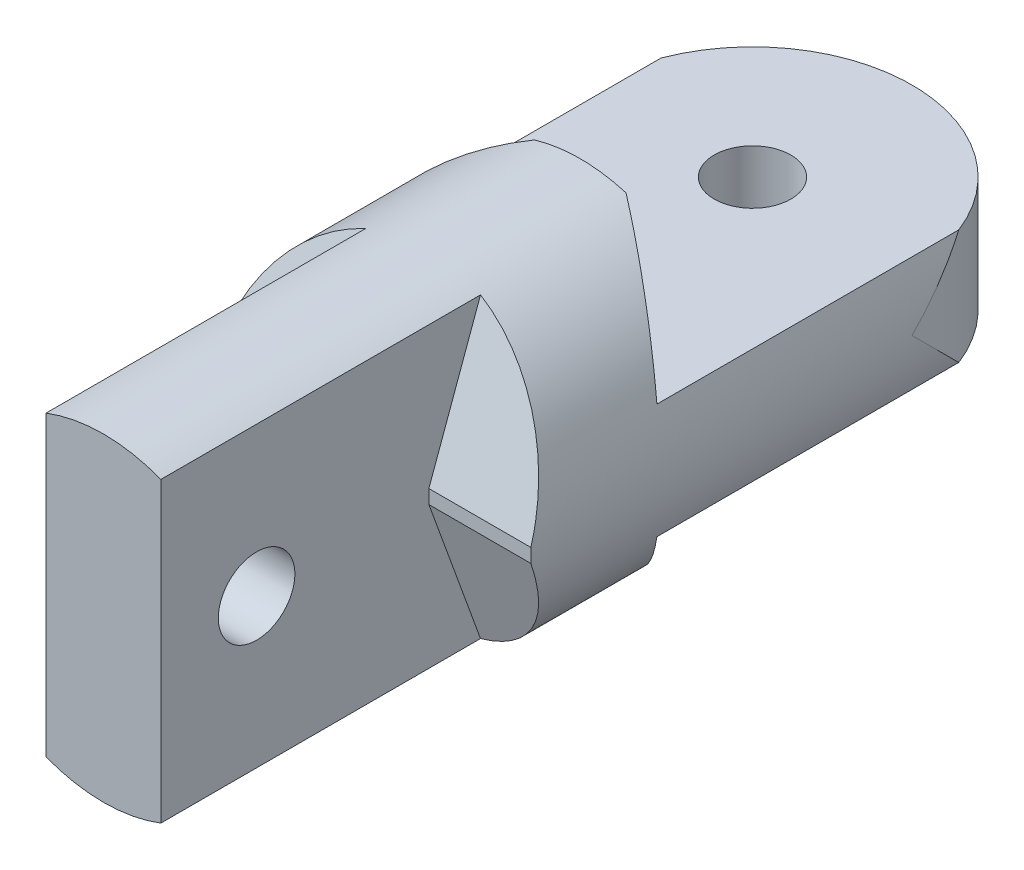
ISO-10303-21;
HEADER;
FILE_DESCRIPTION(('STEP AP214'),'2;1');
FILE_NAME('part.step','',(''),(''),'','','');
FILE_SCHEMA(('AUTOMOTIVE_DESIGN { 1 0 10303 214 1 1 1 1 }'));
ENDSEC;
DATA;
#1=APPLICATION_CONTEXT('core data for automotive mechanical design processes');
#2=APPLICATION_PROTOCOL_DEFINITION('international standard','automotive_design',2000,#1);
#3=PRODUCT_CONTEXT('',#1,'mechanical');
#4=PRODUCT('Part','Part','',(#3));
#5=PRODUCT_RELATED_PRODUCT_CATEGORY('part','',(#4));
#6=PRODUCT_DEFINITION_FORMATION('','',#4);
#7=PRODUCT_DEFINITION_CONTEXT('part definition',#1,'design');
#8=PRODUCT_DEFINITION('design','',#6,#7);
#9=PRODUCT_DEFINITION_SHAPE('','',#8);
#10=(LENGTH_UNIT() NAMED_UNIT(*) SI_UNIT(.MILLI.,.METRE.));
#11=(NAMED_UNIT(*) PLANE_ANGLE_UNIT() SI_UNIT($,.RADIAN.));
#12=(NAMED_UNIT(*) SI_UNIT($,.STERADIAN.) SOLID_ANGLE_UNIT());
#13=UNCERTAINTY_MEASURE_WITH_UNIT(LENGTH_MEASURE(1.E-05),#10,'distance_accuracy_value','');
#14=(GEOMETRIC_REPRESENTATION_CONTEXT(3) GLOBAL_UNCERTAINTY_ASSIGNED_CONTEXT((#13)) GLOBAL_UNIT_ASSIGNED_CONTEXT((#10,
#11,#12)) REPRESENTATION_CONTEXT('',''));
#15=CARTESIAN_POINT('',(0.,0.,0.));
#16=DIRECTION('',(0.,0.,1.));
#17=DIRECTION('',(1.,0.,0.));
#18=AXIS2_PLACEMENT_3D('',#15,#16,#17);
#19=CARTESIAN_POINT('',(0.,0.,-68.3590613364812));
#20=DIRECTION('',(0.,0.,1.));
#21=DIRECTION('',(1.,0.,0.));
#22=AXIS2_PLACEMENT_3D('',#19,#20,#21);
#23=CYLINDRICAL_SURFACE('',#22,12.5);
#24=CARTESIAN_POINT('',(0.,0.,-26.));
#25=DIRECTION('',(0.,0.,-1.));
#26=DIRECTION('',(0.,-1.,0.));
#27=AXIS2_PLACEMENT_3D('',#24,#25,#26);
#28=CIRCLE('',#27,12.5);
#29=CARTESIAN_POINT('',(12.4881835001478,0.543390160598795,-26.));
#30=VERTEX_POINT('',#29);
#31=CARTESIAN_POINT('',(12.4881835001478,-0.543390160598794,-26.));
#32=VERTEX_POINT('',#31);
#33=EDGE_CURVE('E366',#30,#32,#28,.T.);
#34=ORIENTED_EDGE('',*,*,#33,.T.);
#35=CARTESIAN_POINT('',(0.,0.,-25.8022221559489));
#36=DIRECTION('',(0.,-0.342020143325666,0.939692620785909));
#37=DIRECTION('',(0.,0.939692620785909,0.342020143325666));
#38=AXIS2_PLACEMENT_3D('',#35,#36,#37);
#39=ELLIPSE('',#38,13.3022221559489,12.5);
#40=CARTESIAN_POINT('',(4.5,-11.6619037896906,-30.0468080102725));
#41=VERTEX_POINT('',#40);
#42=EDGE_CURVE('E316',#32,#41,#39,.F.);
#43=ORIENTED_EDGE('',*,*,#42,.T.);
#44=DIRECTION('',(0.,0.,1.));
#45=VECTOR('',#44,1.);
#46=CARTESIAN_POINT('',(4.50000000000004,-11.6619037896906,-26.));
#47=LINE('',#46,#45);
#48=CARTESIAN_POINT('',(4.50000000000004,-11.6619037896906,-5.00000000000001));
#49=VERTEX_POINT('',#48);
#50=EDGE_CURVE('E352',#41,#49,#47,.T.);
#51=ORIENTED_EDGE('',*,*,#50,.T.);
#52=CARTESIAN_POINT('',(0.,0.,-5.));
#53=DIRECTION('',(0.,0.,1.));
#54=DIRECTION('',(1.,0.,0.));
#55=AXIS2_PLACEMENT_3D('',#52,#53,#54);
#56=CIRCLE('',#55,12.5);
#57=CARTESIAN_POINT('',(-4.49999999999996,-11.6619037896906,-5.));
#58=VERTEX_POINT('',#57);
#59=EDGE_CURVE('E336',#58,#49,#56,.T.);
#60=ORIENTED_EDGE('',*,*,#59,.F.);
#61=DIRECTION('',(0.,0.,1.));
#62=VECTOR('',#61,1.);
#63=CARTESIAN_POINT('',(-4.49999999999996,-11.6619037896906,-26.));
#64=LINE('',#63,#62);
#65=CARTESIAN_POINT('',(-4.5,-11.6619037896906,-30.0468080102725));
#66=VERTEX_POINT('',#65);
#67=EDGE_CURVE('E363',#66,#58,#64,.T.);
#68=ORIENTED_EDGE('',*,*,#67,.F.);
#69=CARTESIAN_POINT('',(0.,0.,-25.8022221559489));
#70=DIRECTION('',(0.,0.342020143325666,-0.939692620785909));
#71=DIRECTION('',(0.,0.939692620785909,0.342020143325666));
#72=AXIS2_PLACEMENT_3D('',#69,#70,#71);
#73=ELLIPSE('',#72,13.3022221559489,12.5);
#74=CARTESIAN_POINT('',(-12.4881835001478,-0.543390160598794,-26.));
#75=VERTEX_POINT('',#74);
#76=EDGE_CURVE('E332',#75,#66,#73,.F.);
#77=ORIENTED_EDGE('',*,*,#76,.F.);
#78=CARTESIAN_POINT('',(0.,0.,-26.));
#79=DIRECTION('',(0.,0.,-1.));
#80=DIRECTION('',(0.,-1.,0.));
#81=AXIS2_PLACEMENT_3D('',#78,#79,#80);
#82=CIRCLE('',#81,12.5);
#83=CARTESIAN_POINT('',(-12.4881835001478,0.543390160598795,-26.));
#84=VERTEX_POINT('',#83);
#85=EDGE_CURVE('E362',#75,#84,#82,.T.);
#86=ORIENTED_EDGE('',*,*,#85,.T.);
#87=CARTESIAN_POINT('',(0.,0.,-25.8022221559489));
#88=DIRECTION('',(0.,0.342020143325666,0.939692620785909));
#89=DIRECTION('',(0.,-0.939692620785909,0.342020143325666));
#90=AXIS2_PLACEMENT_3D('',#87,#88,#89);
#91=ELLIPSE('',#90,13.3022221559489,12.5);
#92=CARTESIAN_POINT('',(-4.5,11.6619037896906,-30.0468080102725));
#93=VERTEX_POINT('',#92);
#94=EDGE_CURVE('E325',#84,#93,#91,.F.);
#95=ORIENTED_EDGE('',*,*,#94,.T.);
#96=DIRECTION('',(0.,0.,1.));
#97=VECTOR('',#96,1.);
#98=CARTESIAN_POINT('',(-4.50000000000004,11.6619037896906,-26.));
#99=LINE('',#98,#97);
#100=CARTESIAN_POINT('',(-4.50000000000004,11.6619037896906,-5.));
#101=VERTEX_POINT('',#100);
#102=EDGE_CURVE('E359',#93,#101,#99,.T.);
#103=ORIENTED_EDGE('',*,*,#102,.T.);
#104=CARTESIAN_POINT('',(0.,0.,-5.));
#105=DIRECTION('',(0.,0.,1.));
#106=DIRECTION('',(1.,0.,0.));
#107=AXIS2_PLACEMENT_3D('',#104,#105,#106);
#108=CIRCLE('',#107,12.5);
#109=CARTESIAN_POINT('',(4.49999999999996,11.6619037896906,-5.));
#110=VERTEX_POINT('',#109);
#111=EDGE_CURVE('E344',#110,#101,#108,.T.);
#112=ORIENTED_EDGE('',*,*,#111,.F.);
#113=DIRECTION('',(0.,0.,1.));
#114=VECTOR('',#113,1.);
#115=CARTESIAN_POINT('',(4.49999999999996,11.6619037896906,-26.));
#116=LINE('',#115,#114);
#117=CARTESIAN_POINT('',(4.5,11.6619037896906,-30.0468080102725));
#118=VERTEX_POINT('',#117);
#119=EDGE_CURVE('E374',#118,#110,#116,.T.);
#120=ORIENTED_EDGE('',*,*,#119,.F.);
#121=CARTESIAN_POINT('',(0.,0.,-25.8022221559489));
#122=DIRECTION('',(0.,-0.342020143325666,-0.939692620785909));
#123=DIRECTION('',(0.,-0.939692620785909,0.342020143325666));
#124=AXIS2_PLACEMENT_3D('',#121,#122,#123);
#125=ELLIPSE('',#124,13.3022221559489,12.5);
#126=EDGE_CURVE('E312',#30,#118,#125,.F.);
#127=ORIENTED_EDGE('',*,*,#126,.F.);
#128=EDGE_LOOP('',(#34,#43,#51,#60,#68,#77,#86,#95,#103,#112,#120,#127));
#129=FACE_BOUND('',#128,.T.);
#130=CARTESIAN_POINT('',(0.,0.,-44.8720900376281));
#131=DIRECTION('',(0.573576436351042,0.,-0.819152044288995));
#132=DIRECTION('',(0.819152044288995,0.,0.573576436351042));
#133=AXIS2_PLACEMENT_3D('',#130,#131,#132);
#134=ELLIPSE('',#133,15.2596823595181,12.5);
#135=CARTESIAN_POINT('',(3.58897693042875,-11.9736896816666,-42.3590613364812));
#136=VERTEX_POINT('',#135);
#137=CARTESIAN_POINT('',(11.6619037896906,-4.5,-36.7063370942105));
#138=VERTEX_POINT('',#137);
#139=EDGE_CURVE('E153',#136,#138,#134,.F.);
#140=ORIENTED_EDGE('',*,*,#139,.T.);
#141=DIRECTION('',(0.,0.,-1.));
#142=VECTOR('',#141,1.);
#143=CARTESIAN_POINT('',(11.6619037896906,-4.5,-42.3590613364812));
#144=LINE('',#143,#142);
#145=CARTESIAN_POINT('',(11.6619037896906,-4.5,-60.3590613364812));
#146=VERTEX_POINT('',#145);
#147=EDGE_CURVE('E258',#138,#146,#144,.T.);
#148=ORIENTED_EDGE('',*,*,#147,.T.);
#149=CARTESIAN_POINT('',(0.,0.,-55.8590613364812));
#150=DIRECTION('',(0.,-0.707106781186548,0.707106781186547));
#151=DIRECTION('',(0.,0.707106781186548,0.707106781186547));
#152=AXIS2_PLACEMENT_3D('',#149,#150,#151);
#153=ELLIPSE('',#152,17.6776695296637,12.5);
#154=CARTESIAN_POINT('',(12.5,0.,-55.8590613364812));
#155=VERTEX_POINT('',#154);
#156=EDGE_CURVE('E395',#155,#146,#153,.F.);
#157=ORIENTED_EDGE('',*,*,#156,.F.);
#158=CARTESIAN_POINT('',(0.,0.,-55.8590613364812));
#159=DIRECTION('',(0.,0.707106781186548,0.707106781186547));
#160=DIRECTION('',(0.,-0.707106781186548,0.707106781186547));
#161=AXIS2_PLACEMENT_3D('',#158,#159,#160);
#162=ELLIPSE('',#161,17.6776695296637,12.5);
#163=CARTESIAN_POINT('',(11.6619037896906,4.5,-60.3590613364812));
#164=VERTEX_POINT('',#163);
#165=EDGE_CURVE('E396',#164,#155,#162,.F.);
#166=ORIENTED_EDGE('',*,*,#165,.F.);
#167=DIRECTION('',(0.,0.,-1.));
#168=VECTOR('',#167,1.);
#169=CARTESIAN_POINT('',(11.6619037896906,4.5,-42.3590613364812));
#170=LINE('',#169,#168);
#171=CARTESIAN_POINT('',(11.6619037896906,4.5,-36.7063370942105));
#172=VERTEX_POINT('',#171);
#173=EDGE_CURVE('E409',#172,#164,#170,.T.);
#174=ORIENTED_EDGE('',*,*,#173,.F.);
#175=CARTESIAN_POINT('',(0.,0.,-44.8720900376281));
#176=DIRECTION('',(-0.573576436351042,0.,0.819152044288995));
#177=DIRECTION('',(0.819152044288995,0.,0.573576436351042));
#178=AXIS2_PLACEMENT_3D('',#175,#176,#177);
#179=ELLIPSE('',#178,15.2596823595181,12.5);
#180=CARTESIAN_POINT('',(3.58897693042875,11.9736896816666,-42.3590613364812));
#181=VERTEX_POINT('',#180);
#182=EDGE_CURVE('E294',#181,#172,#179,.F.);
#183=ORIENTED_EDGE('',*,*,#182,.F.);
#184=CARTESIAN_POINT('',(0.,0.,-42.3590613364812));
#185=DIRECTION('',(0.,0.,-1.));
#186=DIRECTION('',(-1.,0.,0.));
#187=AXIS2_PLACEMENT_3D('',#184,#185,#186);
#188=CIRCLE('',#187,12.5);
#189=CARTESIAN_POINT('',(-3.58897693042875,11.9736896816666,-42.3590613364812));
#190=VERTEX_POINT('',#189);
#191=EDGE_CURVE('E417',#190,#181,#188,.T.);
#192=ORIENTED_EDGE('',*,*,#191,.F.);
#193=CARTESIAN_POINT('',(0.,0.,-44.8720900376281));
#194=DIRECTION('',(-0.573576436351042,0.,-0.819152044288995));
#195=DIRECTION('',(-0.819152044288995,0.,0.573576436351042));
#196=AXIS2_PLACEMENT_3D('',#193,#194,#195);
#197=ELLIPSE('',#196,15.2596823595181,12.5);
#198=CARTESIAN_POINT('',(-11.6619037896906,4.5,-36.7063370942105));
#199=VERTEX_POINT('',#198);
#200=EDGE_CURVE('E160',#190,#199,#197,.F.);
#201=ORIENTED_EDGE('',*,*,#200,.T.);
#202=DIRECTION('',(0.,0.,-1.));
#203=VECTOR('',#202,1.);
#204=CARTESIAN_POINT('',(-11.6619037896906,4.5,-42.3590613364812));
#205=LINE('',#204,#203);
#206=CARTESIAN_POINT('',(-11.6619037896906,4.5,-60.3590613364812));
#207=VERTEX_POINT('',#206);
#208=EDGE_CURVE('E421',#199,#207,#205,.T.);
#209=ORIENTED_EDGE('',*,*,#208,.T.);
#210=CARTESIAN_POINT('',(-12.5,0.,-55.8590613364812));
#211=VERTEX_POINT('',#210);
#212=EDGE_CURVE('E399',#211,#207,#162,.F.);
#213=ORIENTED_EDGE('',*,*,#212,.F.);
#214=CARTESIAN_POINT('',(-11.6619037896906,-4.5,-60.3590613364812));
#215=VERTEX_POINT('',#214);
#216=EDGE_CURVE('E392',#215,#211,#153,.F.);
#217=ORIENTED_EDGE('',*,*,#216,.F.);
#218=DIRECTION('',(0.,0.,-1.));
#219=VECTOR('',#218,1.);
#220=CARTESIAN_POINT('',(-11.6619037896906,-4.5,-42.3590613364812));
#221=LINE('',#220,#219);
#222=CARTESIAN_POINT('',(-11.6619037896906,-4.5,-36.7063370942105));
#223=VERTEX_POINT('',#222);
#224=EDGE_CURVE('E270',#223,#215,#221,.T.);
#225=ORIENTED_EDGE('',*,*,#224,.F.);
#226=CARTESIAN_POINT('',(0.,0.,-44.8720900376281));
#227=DIRECTION('',(0.573576436351042,0.,0.819152044288995));
#228=DIRECTION('',(-0.819152044288995,0.,0.573576436351042));
#229=AXIS2_PLACEMENT_3D('',#226,#227,#228);
#230=ELLIPSE('',#229,15.2596823595181,12.5);
#231=CARTESIAN_POINT('',(-3.58897693042875,-11.9736896816666,-42.3590613364812));
#232=VERTEX_POINT('',#231);
#233=EDGE_CURVE('E282',#232,#223,#230,.F.);
#234=ORIENTED_EDGE('',*,*,#233,.F.);
#235=CARTESIAN_POINT('',(0.,0.,-42.3590613364812));
#236=DIRECTION('',(0.,0.,-1.));
#237=DIRECTION('',(-1.,0.,0.));
#238=AXIS2_PLACEMENT_3D('',#235,#236,#237);
#239=CIRCLE('',#238,12.5);
#240=EDGE_CURVE('E277',#136,#232,#239,.T.);
#241=ORIENTED_EDGE('',*,*,#240,.F.);
#242=EDGE_LOOP('',(#140,#148,#157,#166,#174,#183,#192,#201,#209,#213,#217,#225,#234,#241));
#243=FACE_BOUND('',#242,.T.);
#244=ADVANCED_FACE('F138',(#129,#243),#23,.T.);
#245=CARTESIAN_POINT('',(0.,0.,-42.3590613364812));
#246=DIRECTION('',(0.,0.,-1.));
#247=DIRECTION('',(-1.,0.,0.));
#248=AXIS2_PLACEMENT_3D('',#245,#246,#247);
#249=PLANE('',#248);
#250=DIRECTION('',(1.,0.,0.));
#251=VECTOR('',#250,1.);
#252=CARTESIAN_POINT('',(0.,-4.5,-42.3590613364812));
#253=LINE('',#252,#251);
#254=CARTESIAN_POINT('',(-3.58897693042875,-4.5,-42.3590613364812));
#255=VERTEX_POINT('',#254);
#256=CARTESIAN_POINT('',(3.58897693042875,-4.5,-42.3590613364812));
#257=VERTEX_POINT('',#256);
#258=EDGE_CURVE('E408',#255,#257,#253,.T.);
#259=ORIENTED_EDGE('',*,*,#258,.T.);
#260=DIRECTION('',(0.,-1.,0.));
#261=VECTOR('',#260,1.);
#262=CARTESIAN_POINT('',(3.58897693042875,0.,-42.3590613364812));
#263=LINE('',#262,#261);
#264=EDGE_CURVE('E13',#257,#136,#263,.T.);
#265=ORIENTED_EDGE('',*,*,#264,.T.);
#266=ORIENTED_EDGE('',*,*,#240,.T.);
#267=DIRECTION('',(0.,-1.,0.));
#268=VECTOR('',#267,1.);
#269=CARTESIAN_POINT('',(-3.58897693042875,0.,-42.3590613364812));
#270=LINE('',#269,#268);
#271=EDGE_CURVE('E146',#255,#232,#270,.T.);
#272=ORIENTED_EDGE('',*,*,#271,.F.);
#273=EDGE_LOOP('',(#259,#265,#266,#272));
#274=FACE_BOUND('',#273,.T.);
#275=ADVANCED_FACE('F489',(#274),#249,.T.);
#276=CARTESIAN_POINT('',(0.,0.,-42.3590613364812));
#277=DIRECTION('',(0.,0.,-1.));
#278=DIRECTION('',(-1.,0.,0.));
#279=AXIS2_PLACEMENT_3D('',#276,#277,#278);
#280=PLANE('',#279);
#281=DIRECTION('',(0.,1.,0.));
#282=VECTOR('',#281,1.);
#283=CARTESIAN_POINT('',(3.58897693042875,0.,-42.3590613364812));
#284=LINE('',#283,#282);
#285=CARTESIAN_POINT('',(3.58897693042875,4.5,-42.3590613364812));
#286=VERTEX_POINT('',#285);
#287=EDGE_CURVE('E291',#286,#181,#284,.T.);
#288=ORIENTED_EDGE('',*,*,#287,.F.);
#289=DIRECTION('',(1.,0.,0.));
#290=VECTOR('',#289,1.);
#291=CARTESIAN_POINT('',(0.,4.5,-42.3590613364812));
#292=LINE('',#291,#290);
#293=CARTESIAN_POINT('',(-3.58897693042875,4.5,-42.3590613364812));
#294=VERTEX_POINT('',#293);
#295=EDGE_CURVE('E404',#294,#286,#292,.T.);
#296=ORIENTED_EDGE('',*,*,#295,.F.);
#297=DIRECTION('',(0.,1.,0.));
#298=VECTOR('',#297,1.);
#299=CARTESIAN_POINT('',(-3.58897693042875,0.,-42.3590613364812));
#300=LINE('',#299,#298);
#301=EDGE_CURVE('E445',#294,#190,#300,.T.);
#302=ORIENTED_EDGE('',*,*,#301,.T.);
#303=ORIENTED_EDGE('',*,*,#191,.T.);
#304=EDGE_LOOP('',(#288,#296,#302,#303));
#305=FACE_BOUND('',#304,.T.);
#306=ADVANCED_FACE('F474',(#305),#280,.T.);
#307=CARTESIAN_POINT('',(0.,0.,-26.));
#308=DIRECTION('',(0.,0.,1.));
#309=DIRECTION('',(0.,-1.,0.));
#310=AXIS2_PLACEMENT_3D('',#307,#308,#309);
#311=PLANE('',#310);
#312=DIRECTION('',(0.,1.,0.));
#313=VECTOR('',#312,1.);
#314=CARTESIAN_POINT('',(4.5,0.,-26.));
#315=LINE('',#314,#313);
#316=CARTESIAN_POINT('',(4.5,-0.543390160598794,-26.));
#317=VERTEX_POINT('',#316);
#318=CARTESIAN_POINT('',(4.5,0.543390160598795,-26.));
#319=VERTEX_POINT('',#318);
#320=EDGE_CURVE('E377',#317,#319,#315,.T.);
#321=ORIENTED_EDGE('',*,*,#320,.F.);
#322=DIRECTION('',(1.,0.,0.));
#323=VECTOR('',#322,1.);
#324=CARTESIAN_POINT('',(0.,-0.543390160598794,-26.));
#325=LINE('',#324,#323);
#326=EDGE_CURVE('E441',#317,#32,#325,.T.);
#327=ORIENTED_EDGE('',*,*,#326,.T.);
#328=ORIENTED_EDGE('',*,*,#33,.F.);
#329=DIRECTION('',(1.,0.,0.));
#330=VECTOR('',#329,1.);
#331=CARTESIAN_POINT('',(0.,0.543390160598795,-26.));
#332=LINE('',#331,#330);
#333=EDGE_CURVE('E438',#319,#30,#332,.T.);
#334=ORIENTED_EDGE('',*,*,#333,.F.);
#335=EDGE_LOOP('',(#321,#327,#328,#334));
#336=FACE_BOUND('',#335,.T.);
#337=ADVANCED_FACE('F500',(#336),#311,.T.);
#338=CARTESIAN_POINT('',(0.,0.,-26.));
#339=DIRECTION('',(0.,0.,1.));
#340=DIRECTION('',(0.,-1.,0.));
#341=AXIS2_PLACEMENT_3D('',#338,#339,#340);
#342=PLANE('',#341);
#343=DIRECTION('',(-1.,0.,0.));
#344=VECTOR('',#343,1.);
#345=CARTESIAN_POINT('',(0.,-0.543390160598794,-26.));
#346=LINE('',#345,#344);
#347=CARTESIAN_POINT('',(-4.5,-0.543390160598794,-26.));
#348=VERTEX_POINT('',#347);
#349=EDGE_CURVE('E435',#348,#75,#346,.T.);
#350=ORIENTED_EDGE('',*,*,#349,.F.);
#351=DIRECTION('',(0.,1.,0.));
#352=VECTOR('',#351,1.);
#353=CARTESIAN_POINT('',(-4.5,0.,-26.));
#354=LINE('',#353,#352);
#355=CARTESIAN_POINT('',(-4.5,0.543390160598789,-26.));
#356=VERTEX_POINT('',#355);
#357=EDGE_CURVE('E370',#348,#356,#354,.T.);
#358=ORIENTED_EDGE('',*,*,#357,.T.);
#359=DIRECTION('',(-1.,0.,0.));
#360=VECTOR('',#359,1.);
#361=CARTESIAN_POINT('',(0.,0.543390160598795,-26.));
#362=LINE('',#361,#360);
#363=EDGE_CURVE('E431',#356,#84,#362,.T.);
#364=ORIENTED_EDGE('',*,*,#363,.T.);
#365=ORIENTED_EDGE('',*,*,#85,.F.);
#366=EDGE_LOOP('',(#350,#358,#364,#365));
#367=FACE_BOUND('',#366,.T.);
#368=ADVANCED_FACE('F522',(#367),#342,.T.);
#369=CARTESIAN_POINT('',(-4.5,0.,-26.));
#370=DIRECTION('',(1.,0.,0.));
#371=DIRECTION('',(0.,0.,-1.));
#372=AXIS2_PLACEMENT_3D('',#369,#370,#371);
#373=PLANE('',#372);
#374=DIRECTION('',(0.,-1.,0.));
#375=VECTOR('',#374,1.);
#376=CARTESIAN_POINT('',(-4.50000000000004,11.6619037896906,-5.));
#377=LINE('',#376,#375);
#378=EDGE_CURVE('E348',#101,#58,#377,.T.);
#379=ORIENTED_EDGE('',*,*,#378,.F.);
#380=ORIENTED_EDGE('',*,*,#102,.F.);
#381=DIRECTION('',(0.,0.939692620785909,-0.342020143325666));
#382=VECTOR('',#381,1.);
#383=CARTESIAN_POINT('',(-4.5,-60.3140998160292,-3.84968511635381));
#384=LINE('',#383,#382);
#385=EDGE_CURVE('E320',#356,#93,#384,.T.);
#386=ORIENTED_EDGE('',*,*,#385,.F.);
#387=ORIENTED_EDGE('',*,*,#357,.F.);
#388=DIRECTION('',(0.,-0.939692620785909,-0.342020143325666));
#389=VECTOR('',#388,1.);
#390=CARTESIAN_POINT('',(-4.5,8.29267435211168,-22.7839355293175));
#391=LINE('',#390,#389);
#392=EDGE_CURVE('E321',#348,#66,#391,.T.);
#393=ORIENTED_EDGE('',*,*,#392,.T.);
#394=ORIENTED_EDGE('',*,*,#67,.T.);
#395=EDGE_LOOP('',(#379,#380,#386,#387,#393,#394));
#396=FACE_BOUND('',#395,.T.);
#397=CARTESIAN_POINT('',(-4.5,0.,-12.5));
#398=DIRECTION('',(1.,0.,0.));
#399=DIRECTION('',(0.,0.,-1.));
#400=AXIS2_PLACEMENT_3D('',#397,#398,#399);
#401=CIRCLE('',#400,3.);
#402=CARTESIAN_POINT('',(-4.5,0.,-9.49999999999999));
#403=VERTEX_POINT('',#402);
#404=EDGE_CURVE('E358',#403,#403,#401,.T.);
#405=ORIENTED_EDGE('',*,*,#404,.T.);
#406=EDGE_LOOP('',(#405));
#407=FACE_BOUND('',#406,.T.);
#408=ADVANCED_FACE('F512',(#396,#407),#373,.F.);
#409=CARTESIAN_POINT('',(4.5,0.,-26.));
#410=DIRECTION('',(1.,0.,0.));
#411=DIRECTION('',(0.,0.,-1.));
#412=AXIS2_PLACEMENT_3D('',#409,#410,#411);
#413=PLANE('',#412);
#414=DIRECTION('',(0.,-0.939692620785909,-0.342020143325666));
#415=VECTOR('',#414,1.);
#416=CARTESIAN_POINT('',(4.5,8.29267435211168,-22.7839355293175));
#417=LINE('',#416,#415);
#418=EDGE_CURVE('E308',#317,#41,#417,.T.);
#419=ORIENTED_EDGE('',*,*,#418,.F.);
#420=ORIENTED_EDGE('',*,*,#320,.T.);
#421=DIRECTION('',(0.,0.939692620785909,-0.342020143325666));
#422=VECTOR('',#421,1.);
#423=CARTESIAN_POINT('',(4.5,-60.3140998160292,-3.84968511635381));
#424=LINE('',#423,#422);
#425=EDGE_CURVE('E304',#319,#118,#424,.T.);
#426=ORIENTED_EDGE('',*,*,#425,.T.);
#427=ORIENTED_EDGE('',*,*,#119,.T.);
#428=DIRECTION('',(0.,1.,0.));
#429=VECTOR('',#428,1.);
#430=CARTESIAN_POINT('',(4.50000000000004,-11.6619037896906,-5.));
#431=LINE('',#430,#429);
#432=EDGE_CURVE('E340',#49,#110,#431,.T.);
#433=ORIENTED_EDGE('',*,*,#432,.F.);
#434=ORIENTED_EDGE('',*,*,#50,.F.);
#435=EDGE_LOOP('',(#419,#420,#426,#427,#433,#434));
#436=FACE_BOUND('',#435,.T.);
#437=CARTESIAN_POINT('',(4.5,0.,-12.5));
#438=DIRECTION('',(1.,0.,0.));
#439=DIRECTION('',(0.,0.,-1.));
#440=AXIS2_PLACEMENT_3D('',#437,#438,#439);
#441=CIRCLE('',#440,3.);
#442=CARTESIAN_POINT('',(4.5,0.,-9.49999999999999));
#443=VERTEX_POINT('',#442);
#444=EDGE_CURVE('E353',#443,#443,#441,.T.);
#445=ORIENTED_EDGE('',*,*,#444,.F.);
#446=EDGE_LOOP('',(#445));
#447=FACE_BOUND('',#446,.T.);
#448=ADVANCED_FACE('F503',(#436,#447),#413,.T.);
#449=CARTESIAN_POINT('',(0.,4.5,-42.3590613364812));
#450=DIRECTION('',(0.,1.,0.));
#451=DIRECTION('',(0.,0.,1.));
#452=AXIS2_PLACEMENT_3D('',#449,#450,#451);
#453=PLANE('',#452);
#454=ORIENTED_EDGE('',*,*,#173,.T.);
#455=CARTESIAN_POINT('',(0.,4.5,-55.8590613364812));
#456=DIRECTION('',(0.,1.,0.));
#457=DIRECTION('',(0.,0.,1.));
#458=AXIS2_PLACEMENT_3D('',#455,#456,#457);
#459=CIRCLE('',#458,12.5);
#460=EDGE_CURVE('E357',#207,#164,#459,.F.);
#461=ORIENTED_EDGE('',*,*,#460,.F.);
#462=ORIENTED_EDGE('',*,*,#208,.F.);
#463=DIRECTION('',(0.819152044288995,0.,-0.573576436351042));
#464=VECTOR('',#463,1.);
#465=CARTESIAN_POINT('',(24.2856010075362,4.5,-61.8770509330581));
#466=LINE('',#465,#464);
#467=EDGE_CURVE('E298',#199,#294,#466,.T.);
#468=ORIENTED_EDGE('',*,*,#467,.T.);
#469=ORIENTED_EDGE('',*,*,#295,.T.);
#470=DIRECTION('',(-0.819152044288995,0.,-0.573576436351042));
#471=VECTOR('',#470,1.);
#472=CARTESIAN_POINT('',(-24.2856010075362,4.5,-61.8770509330581));
#473=LINE('',#472,#471);
#474=EDGE_CURVE('E288',#172,#286,#473,.T.);
#475=ORIENTED_EDGE('',*,*,#474,.F.);
#476=EDGE_LOOP('',(#454,#461,#462,#468,#469,#475));
#477=FACE_BOUND('',#476,.T.);
#478=CARTESIAN_POINT('',(0.,4.5,-55.8590613364812));
#479=DIRECTION('',(0.,1.,0.));
#480=DIRECTION('',(0.,0.,1.));
#481=AXIS2_PLACEMENT_3D('',#478,#479,#480);
#482=CIRCLE('',#481,3.);
#483=CARTESIAN_POINT('',(0.,4.5,-52.8590613364812));
#484=VERTEX_POINT('',#483);
#485=EDGE_CURVE('E400',#484,#484,#482,.F.);
#486=ORIENTED_EDGE('',*,*,#485,.T.);
#487=EDGE_LOOP('',(#486));
#488=FACE_BOUND('',#487,.T.);
#489=ADVANCED_FACE('F464',(#477,#488),#453,.T.);
#490=CARTESIAN_POINT('',(0.,-4.5,-42.3590613364812));
#491=DIRECTION('',(0.,1.,0.));
#492=DIRECTION('',(0.,0.,1.));
#493=AXIS2_PLACEMENT_3D('',#490,#491,#492);
#494=PLANE('',#493);
#495=CARTESIAN_POINT('',(0.,-4.5,-55.8590613364812));
#496=DIRECTION('',(0.,1.,0.));
#497=DIRECTION('',(0.,0.,1.));
#498=AXIS2_PLACEMENT_3D('',#495,#496,#497);
#499=CIRCLE('',#498,12.5);
#500=EDGE_CURVE('E265',#215,#146,#499,.F.);
#501=ORIENTED_EDGE('',*,*,#500,.T.);
#502=ORIENTED_EDGE('',*,*,#147,.F.);
#503=DIRECTION('',(-0.819152044288995,0.,-0.573576436351042));
#504=VECTOR('',#503,1.);
#505=CARTESIAN_POINT('',(-24.2856010075362,-4.5,-61.8770509330581));
#506=LINE('',#505,#504);
#507=EDGE_CURVE('E262',#138,#257,#506,.T.);
#508=ORIENTED_EDGE('',*,*,#507,.T.);
#509=ORIENTED_EDGE('',*,*,#258,.F.);
#510=DIRECTION('',(0.819152044288995,0.,-0.573576436351042));
#511=VECTOR('',#510,1.);
#512=CARTESIAN_POINT('',(24.2856010075362,-4.5,-61.8770509330581));
#513=LINE('',#512,#511);
#514=EDGE_CURVE('E279',#223,#255,#513,.T.);
#515=ORIENTED_EDGE('',*,*,#514,.F.);
#516=ORIENTED_EDGE('',*,*,#224,.T.);
#517=EDGE_LOOP('',(#501,#502,#508,#509,#515,#516));
#518=FACE_BOUND('',#517,.T.);
#519=CARTESIAN_POINT('',(0.,-4.5,-55.8590613364812));
#520=DIRECTION('',(0.,1.,0.));
#521=DIRECTION('',(0.,0.,1.));
#522=AXIS2_PLACEMENT_3D('',#519,#520,#521);
#523=CIRCLE('',#522,3.);
#524=CARTESIAN_POINT('',(0.,-4.5,-52.8590613364812));
#525=VERTEX_POINT('',#524);
#526=EDGE_CURVE('E405',#525,#525,#523,.F.);
#527=ORIENTED_EDGE('',*,*,#526,.F.);
#528=EDGE_LOOP('',(#527));
#529=FACE_BOUND('',#528,.T.);
#530=ADVANCED_FACE('F259',(#518,#529),#494,.F.);
#531=CARTESIAN_POINT('',(0.,-35.5,-55.8590613364812));
#532=DIRECTION('',(0.,1.,0.));
#533=DIRECTION('',(0.,0.,1.));
#534=AXIS2_PLACEMENT_3D('',#531,#532,#533);
#535=CYLINDRICAL_SURFACE('',#534,3.);
#536=CARTESIAN_POINT('',(0.,4.5,-52.8590613364812));
#537=CARTESIAN_POINT('',(0.,4.40625,-52.8590613364812));
#538=CARTESIAN_POINT('',(0.,4.3125,-52.8590613364812));
#539=CARTESIAN_POINT('',(0.,4.125,-52.8590613364812));
#540=CARTESIAN_POINT('',(0.,4.03125,-52.8590613364812));
#541=CARTESIAN_POINT('',(0.,3.84375,-52.8590613364812));
#542=CARTESIAN_POINT('',(0.,3.75,-52.8590613364812));
#543=CARTESIAN_POINT('',(0.,3.5625,-52.8590613364812));
#544=CARTESIAN_POINT('',(0.,3.46875,-52.8590613364812));
#545=CARTESIAN_POINT('',(0.,3.28125,-52.8590613364812));
#546=CARTESIAN_POINT('',(0.,3.1875,-52.8590613364812));
#547=CARTESIAN_POINT('',(0.,3.,-52.8590613364812));
#548=CARTESIAN_POINT('',(0.,2.90625,-52.8590613364812));
#549=CARTESIAN_POINT('',(0.,2.71875,-52.8590613364812));
#550=CARTESIAN_POINT('',(0.,2.625,-52.8590613364812));
#551=CARTESIAN_POINT('',(0.,2.4375,-52.8590613364812));
#552=CARTESIAN_POINT('',(0.,2.34375,-52.8590613364812));
#553=CARTESIAN_POINT('',(0.,2.15625,-52.8590613364812));
#554=CARTESIAN_POINT('',(0.,2.0625,-52.8590613364812));
#555=CARTESIAN_POINT('',(0.,1.875,-52.8590613364812));
#556=CARTESIAN_POINT('',(0.,1.78125,-52.8590613364812));
#557=CARTESIAN_POINT('',(0.,1.59375,-52.8590613364812));
#558=CARTESIAN_POINT('',(0.,1.5,-52.8590613364812));
#559=CARTESIAN_POINT('',(0.,1.3125,-52.8590613364812));
#560=CARTESIAN_POINT('',(0.,1.21875,-52.8590613364812));
#561=CARTESIAN_POINT('',(0.,1.03125,-52.8590613364812));
#562=CARTESIAN_POINT('',(0.,0.937499999999996,-52.8590613364812));
#563=CARTESIAN_POINT('',(0.,0.749999999999998,-52.8590613364812));
#564=CARTESIAN_POINT('',(0.,0.656249999999999,-52.8590613364812));
#565=CARTESIAN_POINT('',(0.,0.468749999999999,-52.8590613364812));
#566=CARTESIAN_POINT('',(0.,0.374999999999998,-52.8590613364812));
#567=CARTESIAN_POINT('',(0.,0.187499999999996,-52.8590613364812));
#568=CARTESIAN_POINT('',(0.,0.0937499999999943,-52.8590613364812));
#569=CARTESIAN_POINT('',(0.,-0.0937500000000059,-52.8590613364812));
#570=CARTESIAN_POINT('',(0.,-0.187500000000005,-52.8590613364812));
#571=CARTESIAN_POINT('',(0.,-0.375000000000003,-52.8590613364812));
#572=CARTESIAN_POINT('',(0.,-0.468750000000002,-52.8590613364812));
#573=CARTESIAN_POINT('',(0.,-0.656250000000002,-52.8590613364812));
#574=CARTESIAN_POINT('',(0.,-0.750000000000003,-52.8590613364812));
#575=CARTESIAN_POINT('',(0.,-0.937500000000003,-52.8590613364812));
#576=CARTESIAN_POINT('',(0.,-1.03125,-52.8590613364812));
#577=CARTESIAN_POINT('',(0.,-1.21875,-52.8590613364812));
#578=CARTESIAN_POINT('',(0.,-1.3125,-52.8590613364812));
#579=CARTESIAN_POINT('',(0.,-1.5,-52.8590613364812));
#580=CARTESIAN_POINT('',(0.,-1.59375,-52.8590613364812));
#581=CARTESIAN_POINT('',(0.,-1.78125,-52.8590613364812));
#582=CARTESIAN_POINT('',(0.,-1.875,-52.8590613364812));
#583=CARTESIAN_POINT('',(0.,-2.0625,-52.8590613364812));
#584=CARTESIAN_POINT('',(0.,-2.15625,-52.8590613364812));
#585=CARTESIAN_POINT('',(0.,-2.34375,-52.8590613364812));
#586=CARTESIAN_POINT('',(0.,-2.4375,-52.8590613364812));
#587=CARTESIAN_POINT('',(0.,-2.625,-52.8590613364812));
#588=CARTESIAN_POINT('',(0.,-2.71875,-52.8590613364812));
#589=CARTESIAN_POINT('',(0.,-2.90625,-52.8590613364812));
#590=CARTESIAN_POINT('',(0.,-3.,-52.8590613364812));
#591=CARTESIAN_POINT('',(0.,-3.1875,-52.8590613364812));
#592=CARTESIAN_POINT('',(0.,-3.28125,-52.8590613364812));
#593=CARTESIAN_POINT('',(0.,-3.46875,-52.8590613364812));
#594=CARTESIAN_POINT('',(0.,-3.56250000000001,-52.8590613364812));
#595=CARTESIAN_POINT('',(0.,-3.75000000000001,-52.8590613364812));
#596=CARTESIAN_POINT('',(0.,-3.84375,-52.8590613364812));
#597=CARTESIAN_POINT('',(0.,-4.03125,-52.8590613364812));
#598=CARTESIAN_POINT('',(0.,-4.125,-52.8590613364812));
#599=CARTESIAN_POINT('',(0.,-4.3125,-52.8590613364812));
#600=CARTESIAN_POINT('',(0.,-4.40625,-52.8590613364812));
#601=CARTESIAN_POINT('',(0.,-4.5,-52.8590613364812));
#602=B_SPLINE_CURVE_WITH_KNOTS('',3,(#536,#537,#538,#539,#540,#541,#542,#543,#544,#545,#546,
#547,#548,#549,#550,#551,#552,#553,#554,#555,#556,#557,#558,#559,#560,#561,#562,#563,#564,#565,
#566,#567,#568,#569,#570,#571,#572,#573,#574,#575,#576,#577,#578,#579,#580,#581,#582,#583,#584,
#585,#586,#587,#588,#589,#590,#591,#592,#593,#594,#595,#596,#597,#598,#599,#600,#601),
.UNSPECIFIED.,.F.,.F.,(4,2,2,2,2,2,2,2,2,2,2,2,2,2,2,2,2,2,2,2,2,2,2,2,2,2,2,2,2,2,2,2,4),(0.,
0.281249999999997,0.5625,0.843749999999997,1.125,1.40625,1.6875,1.96875,2.25,2.53125,2.8125,
3.09375,3.375,3.65625,3.9375,4.21875,4.5,4.78125,5.0625,5.34375,5.625,5.90625,6.1875,6.46875,
6.75,7.03125,7.3125,7.59375,7.875,8.15625,8.4375,8.71875,9.),.UNSPECIFIED.);
#603=EDGE_CURVE('BSEAM550',#484,#525,#602,.T.);
#604=ORIENTED_EDGE('',*,*,#485,.F.);
#605=ORIENTED_EDGE('',*,*,#526,.T.);
#606=ORIENTED_EDGE('',*,*,#603,.T.);
#607=ORIENTED_EDGE('',*,*,#603,.F.);
#608=EDGE_LOOP('',(#604,#606,#605,#607));
#609=FACE_BOUND('',#608,.T.);
#610=ADVANCED_FACE('F550',(#609),#535,.F.);
#611=CARTESIAN_POINT('',(0.,-5.5,-55.8590613364812));
#612=DIRECTION('',(0.,1.,0.));
#613=DIRECTION('',(0.,0.,1.));
#614=AXIS2_PLACEMENT_3D('',#611,#612,#613);
#615=CYLINDRICAL_SURFACE('',#614,12.5);
#616=ORIENTED_EDGE('',*,*,#460,.T.);
#617=ORIENTED_EDGE('',*,*,#165,.T.);
#618=ORIENTED_EDGE('',*,*,#156,.T.);
#619=ORIENTED_EDGE('',*,*,#500,.F.);
#620=ORIENTED_EDGE('',*,*,#216,.T.);
#621=ORIENTED_EDGE('',*,*,#212,.T.);
#622=EDGE_LOOP('',(#616,#617,#618,#619,#620,#621));
#623=FACE_BOUND('',#622,.T.);
#624=ADVANCED_FACE('F457',(#623),#615,.T.);
#625=CARTESIAN_POINT('',(35.5,1.23947587528931E-13,-12.5));
#626=DIRECTION('',(-1.,0.,0.));
#627=DIRECTION('',(0.,0.,1.));
#628=AXIS2_PLACEMENT_3D('',#625,#626,#627);
#629=CYLINDRICAL_SURFACE('',#628,3.);
#630=CARTESIAN_POINT('',(4.5,0.,-9.49999999999999));
#631=CARTESIAN_POINT('',(4.40625000000001,0.,-9.49999999999999));
#632=CARTESIAN_POINT('',(4.31250000000001,0.,-9.49999999999999));
#633=CARTESIAN_POINT('',(4.12500000000001,0.,-9.49999999999999));
#634=CARTESIAN_POINT('',(4.03125,0.,-9.49999999999999));
#635=CARTESIAN_POINT('',(3.84375,0.,-9.49999999999999));
#636=CARTESIAN_POINT('',(3.75000000000001,0.,-9.49999999999999));
#637=CARTESIAN_POINT('',(3.56250000000001,0.,-9.49999999999999));
#638=CARTESIAN_POINT('',(3.46875,0.,-9.49999999999999));
#639=CARTESIAN_POINT('',(3.28125,0.,-9.49999999999999));
#640=CARTESIAN_POINT('',(3.1875,0.,-9.49999999999999));
#641=CARTESIAN_POINT('',(3.,0.,-9.49999999999999));
#642=CARTESIAN_POINT('',(2.90625,0.,-9.49999999999999));
#643=CARTESIAN_POINT('',(2.71875,0.,-9.49999999999999));
#644=CARTESIAN_POINT('',(2.625,0.,-9.49999999999999));
#645=CARTESIAN_POINT('',(2.4375,0.,-9.49999999999999));
#646=CARTESIAN_POINT('',(2.34375,0.,-9.49999999999999));
#647=CARTESIAN_POINT('',(2.15625,0.,-9.49999999999999));
#648=CARTESIAN_POINT('',(2.0625,0.,-9.49999999999999));
#649=CARTESIAN_POINT('',(1.875,0.,-9.49999999999999));
#650=CARTESIAN_POINT('',(1.78125,0.,-9.49999999999999));
#651=CARTESIAN_POINT('',(1.59375,0.,-9.49999999999999));
#652=CARTESIAN_POINT('',(1.5,0.,-9.49999999999999));
#653=CARTESIAN_POINT('',(1.3125,0.,-9.49999999999999));
#654=CARTESIAN_POINT('',(1.21875,0.,-9.49999999999999));
#655=CARTESIAN_POINT('',(1.03125,0.,-9.49999999999999));
#656=CARTESIAN_POINT('',(0.937500000000003,0.,-9.49999999999999));
#657=CARTESIAN_POINT('',(0.750000000000003,0.,-9.49999999999999));
#658=CARTESIAN_POINT('',(0.656250000000002,0.,-9.49999999999999));
#659=CARTESIAN_POINT('',(0.468750000000002,0.,-9.49999999999999));
#660=CARTESIAN_POINT('',(0.375000000000003,0.,-9.49999999999999));
#661=CARTESIAN_POINT('',(0.187500000000005,0.,-9.49999999999999));
#662=CARTESIAN_POINT('',(0.0937500000000059,0.,-9.49999999999999));
#663=CARTESIAN_POINT('',(-0.0937499999999943,0.,-9.49999999999999));
#664=CARTESIAN_POINT('',(-0.187499999999996,0.,-9.49999999999999));
#665=CARTESIAN_POINT('',(-0.374999999999998,0.,-9.49999999999999));
#666=CARTESIAN_POINT('',(-0.468749999999999,0.,-9.49999999999999));
#667=CARTESIAN_POINT('',(-0.656249999999999,0.,-9.49999999999999));
#668=CARTESIAN_POINT('',(-0.749999999999998,0.,-9.49999999999999));
#669=CARTESIAN_POINT('',(-0.937499999999996,0.,-9.49999999999999));
#670=CARTESIAN_POINT('',(-1.03125,0.,-9.49999999999999));
#671=CARTESIAN_POINT('',(-1.21875,0.,-9.49999999999999));
#672=CARTESIAN_POINT('',(-1.3125,0.,-9.49999999999999));
#673=CARTESIAN_POINT('',(-1.5,0.,-9.49999999999999));
#674=CARTESIAN_POINT('',(-1.59375,0.,-9.49999999999999));
#675=CARTESIAN_POINT('',(-1.78125,0.,-9.49999999999999));
#676=CARTESIAN_POINT('',(-1.875,0.,-9.49999999999999));
#677=CARTESIAN_POINT('',(-2.0625,0.,-9.49999999999999));
#678=CARTESIAN_POINT('',(-2.15625,0.,-9.49999999999999));
#679=CARTESIAN_POINT('',(-2.34375,0.,-9.49999999999999));
#680=CARTESIAN_POINT('',(-2.4375,0.,-9.49999999999999));
#681=CARTESIAN_POINT('',(-2.625,0.,-9.49999999999999));
#682=CARTESIAN_POINT('',(-2.71875,0.,-9.49999999999999));
#683=CARTESIAN_POINT('',(-2.90625,0.,-9.49999999999999));
#684=CARTESIAN_POINT('',(-3.,0.,-9.49999999999999));
#685=CARTESIAN_POINT('',(-3.1875,0.,-9.49999999999999));
#686=CARTESIAN_POINT('',(-3.28125,0.,-9.49999999999999));
#687=CARTESIAN_POINT('',(-3.46874999999999,0.,-9.49999999999999));
#688=CARTESIAN_POINT('',(-3.56249999999999,0.,-9.49999999999999));
#689=CARTESIAN_POINT('',(-3.74999999999999,0.,-9.49999999999999));
#690=CARTESIAN_POINT('',(-3.84375,0.,-9.49999999999999));
#691=CARTESIAN_POINT('',(-4.03125,0.,-9.49999999999999));
#692=CARTESIAN_POINT('',(-4.125,0.,-9.49999999999999));
#693=CARTESIAN_POINT('',(-4.3125,0.,-9.49999999999999));
#694=CARTESIAN_POINT('',(-4.40625,0.,-9.49999999999999));
#695=CARTESIAN_POINT('',(-4.5,0.,-9.49999999999999));
#696=B_SPLINE_CURVE_WITH_KNOTS('',3,(#630,#631,#632,#633,#634,#635,#636,#637,#638,#639,#640,
#641,#642,#643,#644,#645,#646,#647,#648,#649,#650,#651,#652,#653,#654,#655,#656,#657,#658,#659,
#660,#661,#662,#663,#664,#665,#666,#667,#668,#669,#670,#671,#672,#673,#674,#675,#676,#677,#678,
#679,#680,#681,#682,#683,#684,#685,#686,#687,#688,#689,#690,#691,#692,#693,#694,#695),
.UNSPECIFIED.,.F.,.F.,(4,2,2,2,2,2,2,2,2,2,2,2,2,2,2,2,2,2,2,2,2,2,2,2,2,2,2,2,2,2,2,2,4),(0.,
0.281249999999997,0.5625,0.843749999999997,1.125,1.40625,1.6875,1.96875,2.25,2.53125,2.8125,
3.09375,3.375,3.65625,3.9375,4.21875,4.5,4.78125,5.0625,5.34375,5.625,5.90625,6.1875,6.46875,
6.75,7.03125,7.3125,7.59375,7.875,8.15625,8.4375,8.71875,9.),.UNSPECIFIED.);
#697=EDGE_CURVE('BSEAM536',#443,#403,#696,.T.);
#698=ORIENTED_EDGE('',*,*,#444,.T.);
#699=ORIENTED_EDGE('',*,*,#404,.F.);
#700=ORIENTED_EDGE('',*,*,#697,.T.);
#701=ORIENTED_EDGE('',*,*,#697,.F.);
#702=EDGE_LOOP('',(#698,#700,#699,#701));
#703=FACE_BOUND('',#702,.T.);
#704=ADVANCED_FACE('F536',(#703),#629,.F.);
#705=CARTESIAN_POINT('',(0.,0.,-5.));
#706=DIRECTION('',(0.,0.,1.));
#707=DIRECTION('',(1.,0.,0.));
#708=AXIS2_PLACEMENT_3D('',#705,#706,#707);
#709=PLANE('',#708);
#710=ORIENTED_EDGE('',*,*,#59,.T.);
#711=ORIENTED_EDGE('',*,*,#432,.T.);
#712=ORIENTED_EDGE('',*,*,#111,.T.);
#713=ORIENTED_EDGE('',*,*,#378,.T.);
#714=EDGE_LOOP('',(#710,#711,#712,#713));
#715=FACE_BOUND('',#714,.T.);
#716=ADVANCED_FACE('F508',(#715),#709,.T.);
#717=CARTESIAN_POINT('',(-4.5,-60.3140998160292,-3.84968511635381));
#718=DIRECTION('',(0.,0.342020143325666,0.939692620785909));
#719=DIRECTION('',(0.,-0.939692620785909,0.342020143325666));
#720=AXIS2_PLACEMENT_3D('',#717,#718,#719);
#721=PLANE('',#720);
#722=ORIENTED_EDGE('',*,*,#363,.F.);
#723=ORIENTED_EDGE('',*,*,#385,.T.);
#724=ORIENTED_EDGE('',*,*,#94,.F.);
#725=EDGE_LOOP('',(#722,#723,#724));
#726=FACE_BOUND('',#725,.T.);
#727=ADVANCED_FACE('F524',(#726),#721,.T.);
#728=CARTESIAN_POINT('',(-4.5,8.29267435211168,-22.7839355293175));
#729=DIRECTION('',(0.,0.342020143325666,-0.939692620785909));
#730=DIRECTION('',(0.,0.939692620785909,0.342020143325666));
#731=AXIS2_PLACEMENT_3D('',#728,#729,#730);
#732=PLANE('',#731);
#733=ORIENTED_EDGE('',*,*,#76,.T.);
#734=ORIENTED_EDGE('',*,*,#392,.F.);
#735=ORIENTED_EDGE('',*,*,#349,.T.);
#736=EDGE_LOOP('',(#733,#734,#735));
#737=FACE_BOUND('',#736,.T.);
#738=ADVANCED_FACE('F519',(#737),#732,.F.);
#739=CARTESIAN_POINT('',(4.5,-60.3140998160292,-3.84968511635381));
#740=DIRECTION('',(0.,-0.342020143325666,-0.939692620785909));
#741=DIRECTION('',(0.,0.939692620785909,-0.342020143325666));
#742=AXIS2_PLACEMENT_3D('',#739,#740,#741);
#743=PLANE('',#742);
#744=ORIENTED_EDGE('',*,*,#126,.T.);
#745=ORIENTED_EDGE('',*,*,#425,.F.);
#746=ORIENTED_EDGE('',*,*,#333,.T.);
#747=EDGE_LOOP('',(#744,#745,#746));
#748=FACE_BOUND('',#747,.T.);
#749=ADVANCED_FACE('F484',(#748),#743,.F.);
#750=CARTESIAN_POINT('',(4.5,8.29267435211168,-22.7839355293175));
#751=DIRECTION('',(0.,-0.342020143325666,0.939692620785909));
#752=DIRECTION('',(0.,-0.939692620785909,-0.342020143325666));
#753=AXIS2_PLACEMENT_3D('',#750,#751,#752);
#754=PLANE('',#753);
#755=ORIENTED_EDGE('',*,*,#326,.F.);
#756=ORIENTED_EDGE('',*,*,#418,.T.);
#757=ORIENTED_EDGE('',*,*,#42,.F.);
#758=EDGE_LOOP('',(#755,#756,#757));
#759=FACE_BOUND('',#758,.T.);
#760=ADVANCED_FACE('F477',(#759),#754,.T.);
#761=CARTESIAN_POINT('',(24.2856010075362,14.5,-61.8770509330581));
#762=DIRECTION('',(-0.573576436351042,0.,-0.819152044288995));
#763=DIRECTION('',(-0.819152044288995,0.,0.573576436351042));
#764=AXIS2_PLACEMENT_3D('',#761,#762,#763);
#765=PLANE('',#764);
#766=ORIENTED_EDGE('',*,*,#301,.F.);
#767=ORIENTED_EDGE('',*,*,#467,.F.);
#768=ORIENTED_EDGE('',*,*,#200,.F.);
#769=EDGE_LOOP('',(#766,#767,#768));
#770=FACE_BOUND('',#769,.T.);
#771=ADVANCED_FACE('F475',(#770),#765,.T.);
#772=CARTESIAN_POINT('',(-24.2856010075362,14.5,-61.8770509330581));
#773=DIRECTION('',(-0.573576436351042,0.,0.819152044288995));
#774=DIRECTION('',(0.819152044288995,0.,0.573576436351042));
#775=AXIS2_PLACEMENT_3D('',#772,#773,#774);
#776=PLANE('',#775);
#777=ORIENTED_EDGE('',*,*,#182,.T.);
#778=ORIENTED_EDGE('',*,*,#474,.T.);
#779=ORIENTED_EDGE('',*,*,#287,.T.);
#780=EDGE_LOOP('',(#777,#778,#779));
#781=FACE_BOUND('',#780,.T.);
#782=ADVANCED_FACE('F470',(#781),#776,.F.);
#783=CARTESIAN_POINT('',(24.2856010075362,-14.5,-61.8770509330581));
#784=DIRECTION('',(0.573576436351042,0.,0.819152044288995));
#785=DIRECTION('',(0.819152044288995,0.,-0.573576436351042));
#786=AXIS2_PLACEMENT_3D('',#783,#784,#785);
#787=PLANE('',#786);
#788=ORIENTED_EDGE('',*,*,#233,.T.);
#789=ORIENTED_EDGE('',*,*,#514,.T.);
#790=ORIENTED_EDGE('',*,*,#271,.T.);
#791=EDGE_LOOP('',(#788,#789,#790));
#792=FACE_BOUND('',#791,.T.);
#793=ADVANCED_FACE('F451',(#792),#787,.F.);
#794=CARTESIAN_POINT('',(-24.2856010075362,-14.5,-61.8770509330581));
#795=DIRECTION('',(0.573576436351042,0.,-0.819152044288995));
#796=DIRECTION('',(-0.819152044288995,0.,-0.573576436351042));
#797=AXIS2_PLACEMENT_3D('',#794,#795,#796);
#798=PLANE('',#797);
#799=ORIENTED_EDGE('',*,*,#264,.F.);
#800=ORIENTED_EDGE('',*,*,#507,.F.);
#801=ORIENTED_EDGE('',*,*,#139,.F.);
#802=EDGE_LOOP('',(#799,#800,#801));
#803=FACE_BOUND('',#802,.T.);
#804=ADVANCED_FACE('F272',(#803),#798,.T.);
#805=CLOSED_SHELL('',(#244,#275,#306,#337,#368,#408,#448,#489,#530,#610,#624,#704,#716,#727,
#738,#749,#760,#771,#782,#793,#804));
#806=MANIFOLD_SOLID_BREP('B2',#805);
#807=ADVANCED_BREP_SHAPE_REPRESENTATION('',(#18,#806),#14);
#808=SHAPE_DEFINITION_REPRESENTATION(#9,#807);
ENDSEC;
END-ISO-10303-21;
